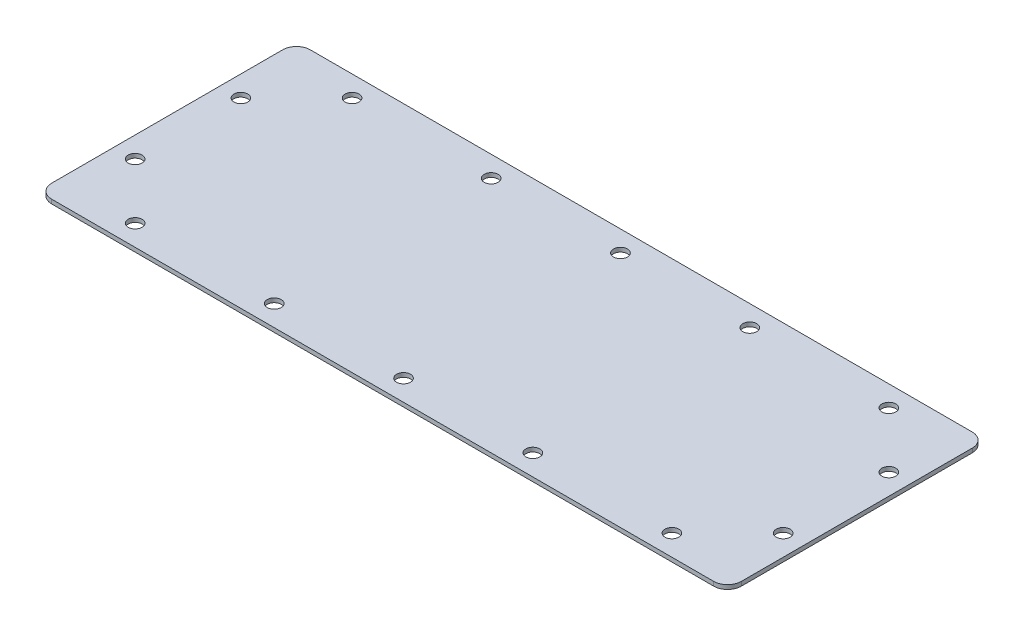
ISO-10303-21;
HEADER;
FILE_DESCRIPTION(('STEP AP214'),'2;1');
FILE_NAME('part.step','',(''),(''),'','','');
FILE_SCHEMA(('AUTOMOTIVE_DESIGN { 1 0 10303 214 1 1 1 1 }'));
ENDSEC;
DATA;
#1=APPLICATION_CONTEXT('core data for automotive mechanical design processes');
#2=APPLICATION_PROTOCOL_DEFINITION('international standard','automotive_design',2000,#1);
#3=PRODUCT_CONTEXT('',#1,'mechanical');
#4=PRODUCT('Part','Part','',(#3));
#5=PRODUCT_RELATED_PRODUCT_CATEGORY('part','',(#4));
#6=PRODUCT_DEFINITION_FORMATION('','',#4);
#7=PRODUCT_DEFINITION_CONTEXT('part definition',#1,'design');
#8=PRODUCT_DEFINITION('design','',#6,#7);
#9=PRODUCT_DEFINITION_SHAPE('','',#8);
#10=(LENGTH_UNIT() NAMED_UNIT(*) SI_UNIT(.MILLI.,.METRE.));
#11=(NAMED_UNIT(*) PLANE_ANGLE_UNIT() SI_UNIT($,.RADIAN.));
#12=(NAMED_UNIT(*) SI_UNIT($,.STERADIAN.) SOLID_ANGLE_UNIT());
#13=UNCERTAINTY_MEASURE_WITH_UNIT(LENGTH_MEASURE(1.E-05),#10,'distance_accuracy_value','');
#14=(GEOMETRIC_REPRESENTATION_CONTEXT(3) GLOBAL_UNCERTAINTY_ASSIGNED_CONTEXT((#13)) GLOBAL_UNIT_ASSIGNED_CONTEXT((#10,
#11,#12)) REPRESENTATION_CONTEXT('',''));
#15=CARTESIAN_POINT('',(0.,0.,0.));
#16=DIRECTION('',(0.,0.,1.));
#17=DIRECTION('',(1.,0.,0.));
#18=AXIS2_PLACEMENT_3D('',#15,#16,#17);
#19=CARTESIAN_POINT('',(238.,3.,-83.));
#20=DIRECTION('',(0.,-1.,0.));
#21=DIRECTION('',(0.,0.,-1.));
#22=AXIS2_PLACEMENT_3D('',#19,#20,#21);
#23=PLANE('',#22);
#24=CARTESIAN_POINT('',(238.,3.,-83.));
#25=DIRECTION('',(0.,1.,0.));
#26=DIRECTION('',(0.,0.,-1.));
#27=AXIS2_PLACEMENT_3D('',#24,#25,#26);
#28=CIRCLE('',#27,10.);
#29=CARTESIAN_POINT('',(248.,3.,-83.));
#30=VERTEX_POINT('',#29);
#31=CARTESIAN_POINT('',(238.,3.,-93.));
#32=VERTEX_POINT('',#31);
#33=EDGE_CURVE('E153',#30,#32,#28,.T.);
#34=ORIENTED_EDGE('',*,*,#33,.T.);
#35=DIRECTION('',(-1.,0.,0.));
#36=VECTOR('',#35,1.);
#37=CARTESIAN_POINT('',(-238.,3.,-93.));
#38=LINE('',#37,#36);
#39=CARTESIAN_POINT('',(-238.,3.,-93.));
#40=VERTEX_POINT('',#39);
#41=EDGE_CURVE('E101',#32,#40,#38,.T.);
#42=ORIENTED_EDGE('',*,*,#41,.T.);
#43=CARTESIAN_POINT('',(-238.,3.,-83.));
#44=DIRECTION('',(0.,1.,0.));
#45=DIRECTION('',(0.,0.,1.));
#46=AXIS2_PLACEMENT_3D('',#43,#44,#45);
#47=CIRCLE('',#46,10.);
#48=CARTESIAN_POINT('',(-248.,3.,-83.));
#49=VERTEX_POINT('',#48);
#50=EDGE_CURVE('E168',#40,#49,#47,.T.);
#51=ORIENTED_EDGE('',*,*,#50,.T.);
#52=DIRECTION('',(0.,0.,1.));
#53=VECTOR('',#52,1.);
#54=CARTESIAN_POINT('',(-248.,3.,-83.));
#55=LINE('',#54,#53);
#56=CARTESIAN_POINT('',(-248.,3.,82.9999999999999));
#57=VERTEX_POINT('',#56);
#58=EDGE_CURVE('E181',#49,#57,#55,.T.);
#59=ORIENTED_EDGE('',*,*,#58,.T.);
#60=CARTESIAN_POINT('',(-238.,3.,83.));
#61=DIRECTION('',(0.,1.,0.));
#62=DIRECTION('',(0.,0.,1.));
#63=AXIS2_PLACEMENT_3D('',#60,#61,#62);
#64=CIRCLE('',#63,10.);
#65=CARTESIAN_POINT('',(-238.,3.,93.));
#66=VERTEX_POINT('',#65);
#67=EDGE_CURVE('E120',#57,#66,#64,.T.);
#68=ORIENTED_EDGE('',*,*,#67,.T.);
#69=DIRECTION('',(1.,0.,0.));
#70=VECTOR('',#69,1.);
#71=CARTESIAN_POINT('',(-238.,3.,93.));
#72=LINE('',#71,#70);
#73=CARTESIAN_POINT('',(238.,3.,93.));
#74=VERTEX_POINT('',#73);
#75=EDGE_CURVE('E114',#66,#74,#72,.T.);
#76=ORIENTED_EDGE('',*,*,#75,.T.);
#77=CARTESIAN_POINT('',(238.,3.,83.));
#78=DIRECTION('',(0.,1.,0.));
#79=DIRECTION('',(0.,0.,1.));
#80=AXIS2_PLACEMENT_3D('',#77,#78,#79);
#81=CIRCLE('',#80,10.);
#82=CARTESIAN_POINT('',(248.,3.,82.9999999999999));
#83=VERTEX_POINT('',#82);
#84=EDGE_CURVE('E118',#74,#83,#81,.T.);
#85=ORIENTED_EDGE('',*,*,#84,.T.);
#86=DIRECTION('',(0.,0.,-1.));
#87=VECTOR('',#86,1.);
#88=CARTESIAN_POINT('',(248.,3.,-83.));
#89=LINE('',#88,#87);
#90=EDGE_CURVE('E58',#83,#30,#89,.T.);
#91=ORIENTED_EDGE('',*,*,#90,.T.);
#92=EDGE_LOOP('',(#34,#42,#51,#59,#68,#76,#85,#91));
#93=FACE_BOUND('',#92,.T.);
#94=CARTESIAN_POINT('',(-193.,3.,-78.));
#95=DIRECTION('',(0.,1.,0.));
#96=DIRECTION('',(0.,0.,1.));
#97=AXIS2_PLACEMENT_3D('',#94,#95,#96);
#98=CIRCLE('',#97,5.00000000000002);
#99=CARTESIAN_POINT('',(-193.,3.,-73.));
#100=VERTEX_POINT('',#99);
#101=EDGE_CURVE('E142',#100,#100,#98,.T.);
#102=ORIENTED_EDGE('',*,*,#101,.F.);
#103=EDGE_LOOP('',(#102));
#104=FACE_BOUND('',#103,.T.);
#105=CARTESIAN_POINT('',(-93.,3.,-78.));
#106=DIRECTION('',(0.,1.,0.));
#107=DIRECTION('',(0.,0.,1.));
#108=AXIS2_PLACEMENT_3D('',#105,#106,#107);
#109=CIRCLE('',#108,5.00000000000001);
#110=CARTESIAN_POINT('',(-93.,3.,-73.));
#111=VERTEX_POINT('',#110);
#112=EDGE_CURVE('E190',#111,#111,#109,.T.);
#113=ORIENTED_EDGE('',*,*,#112,.F.);
#114=EDGE_LOOP('',(#113));
#115=FACE_BOUND('',#114,.T.);
#116=CARTESIAN_POINT('',(0.,3.,-78.));
#117=DIRECTION('',(0.,1.,0.));
#118=DIRECTION('',(0.,0.,1.));
#119=AXIS2_PLACEMENT_3D('',#116,#117,#118);
#120=CIRCLE('',#119,5.);
#121=CARTESIAN_POINT('',(0.,3.,-73.));
#122=VERTEX_POINT('',#121);
#123=EDGE_CURVE('E196',#122,#122,#120,.T.);
#124=ORIENTED_EDGE('',*,*,#123,.F.);
#125=EDGE_LOOP('',(#124));
#126=FACE_BOUND('',#125,.T.);
#127=CARTESIAN_POINT('',(-233.,3.,-38.));
#128=DIRECTION('',(0.,1.,0.));
#129=DIRECTION('',(0.,0.,1.));
#130=AXIS2_PLACEMENT_3D('',#127,#128,#129);
#131=CIRCLE('',#130,4.99999999999999);
#132=CARTESIAN_POINT('',(-233.,3.,-33.));
#133=VERTEX_POINT('',#132);
#134=EDGE_CURVE('E202',#133,#133,#131,.T.);
#135=ORIENTED_EDGE('',*,*,#134,.F.);
#136=EDGE_LOOP('',(#135));
#137=FACE_BOUND('',#136,.T.);
#138=CARTESIAN_POINT('',(92.9999999999999,3.,-78.));
#139=DIRECTION('',(0.,1.,0.));
#140=DIRECTION('',(0.,0.,1.));
#141=AXIS2_PLACEMENT_3D('',#138,#139,#140);
#142=CIRCLE('',#141,5.00000000000001);
#143=CARTESIAN_POINT('',(92.9999999999999,3.,-73.));
#144=VERTEX_POINT('',#143);
#145=EDGE_CURVE('E208',#144,#144,#142,.T.);
#146=ORIENTED_EDGE('',*,*,#145,.F.);
#147=EDGE_LOOP('',(#146));
#148=FACE_BOUND('',#147,.T.);
#149=CARTESIAN_POINT('',(193.,3.,-78.));
#150=DIRECTION('',(0.,1.,0.));
#151=DIRECTION('',(0.,0.,1.));
#152=AXIS2_PLACEMENT_3D('',#149,#150,#151);
#153=CIRCLE('',#152,4.99999999999999);
#154=CARTESIAN_POINT('',(193.,3.,-73.));
#155=VERTEX_POINT('',#154);
#156=EDGE_CURVE('E214',#155,#155,#153,.T.);
#157=ORIENTED_EDGE('',*,*,#156,.F.);
#158=EDGE_LOOP('',(#157));
#159=FACE_BOUND('',#158,.T.);
#160=CARTESIAN_POINT('',(233.,3.,-38.));
#161=DIRECTION('',(0.,1.,0.));
#162=DIRECTION('',(0.,0.,1.));
#163=AXIS2_PLACEMENT_3D('',#160,#161,#162);
#164=CIRCLE('',#163,5.00000000000002);
#165=CARTESIAN_POINT('',(233.,3.,-33.));
#166=VERTEX_POINT('',#165);
#167=EDGE_CURVE('E220',#166,#166,#164,.T.);
#168=ORIENTED_EDGE('',*,*,#167,.F.);
#169=EDGE_LOOP('',(#168));
#170=FACE_BOUND('',#169,.T.);
#171=CARTESIAN_POINT('',(233.,3.,37.9999999999999));
#172=DIRECTION('',(0.,1.,0.));
#173=DIRECTION('',(0.,0.,-1.));
#174=AXIS2_PLACEMENT_3D('',#171,#172,#173);
#175=CIRCLE('',#174,5.00000000000002);
#176=CARTESIAN_POINT('',(233.,3.,32.9999999999999));
#177=VERTEX_POINT('',#176);
#178=EDGE_CURVE('E226',#177,#177,#175,.T.);
#179=ORIENTED_EDGE('',*,*,#178,.F.);
#180=EDGE_LOOP('',(#179));
#181=FACE_BOUND('',#180,.T.);
#182=CARTESIAN_POINT('',(193.,3.,77.9999999999999));
#183=DIRECTION('',(0.,1.,0.));
#184=DIRECTION('',(0.,0.,-1.));
#185=AXIS2_PLACEMENT_3D('',#182,#183,#184);
#186=CIRCLE('',#185,4.99999999999999);
#187=CARTESIAN_POINT('',(193.,3.,72.9999999999999));
#188=VERTEX_POINT('',#187);
#189=EDGE_CURVE('E232',#188,#188,#186,.T.);
#190=ORIENTED_EDGE('',*,*,#189,.F.);
#191=EDGE_LOOP('',(#190));
#192=FACE_BOUND('',#191,.T.);
#193=CARTESIAN_POINT('',(92.9999999999999,3.,77.9999999999999));
#194=DIRECTION('',(0.,1.,0.));
#195=DIRECTION('',(0.,0.,-1.));
#196=AXIS2_PLACEMENT_3D('',#193,#194,#195);
#197=CIRCLE('',#196,5.00000000000001);
#198=CARTESIAN_POINT('',(92.9999999999999,3.,72.9999999999999));
#199=VERTEX_POINT('',#198);
#200=EDGE_CURVE('E238',#199,#199,#197,.T.);
#201=ORIENTED_EDGE('',*,*,#200,.F.);
#202=EDGE_LOOP('',(#201));
#203=FACE_BOUND('',#202,.T.);
#204=CARTESIAN_POINT('',(0.,3.,77.9999999999999));
#205=DIRECTION('',(0.,1.,0.));
#206=DIRECTION('',(0.,0.,-1.));
#207=AXIS2_PLACEMENT_3D('',#204,#205,#206);
#208=CIRCLE('',#207,5.);
#209=CARTESIAN_POINT('',(0.,3.,72.9999999999999));
#210=VERTEX_POINT('',#209);
#211=EDGE_CURVE('E244',#210,#210,#208,.T.);
#212=ORIENTED_EDGE('',*,*,#211,.F.);
#213=EDGE_LOOP('',(#212));
#214=FACE_BOUND('',#213,.T.);
#215=CARTESIAN_POINT('',(-93.,3.,77.9999999999999));
#216=DIRECTION('',(0.,1.,0.));
#217=DIRECTION('',(0.,0.,-1.));
#218=AXIS2_PLACEMENT_3D('',#215,#216,#217);
#219=CIRCLE('',#218,5.00000000000001);
#220=CARTESIAN_POINT('',(-93.,3.,72.9999999999999));
#221=VERTEX_POINT('',#220);
#222=EDGE_CURVE('E250',#221,#221,#219,.T.);
#223=ORIENTED_EDGE('',*,*,#222,.F.);
#224=EDGE_LOOP('',(#223));
#225=FACE_BOUND('',#224,.T.);
#226=CARTESIAN_POINT('',(-193.,3.,77.9999999999999));
#227=DIRECTION('',(0.,1.,0.));
#228=DIRECTION('',(0.,0.,-1.));
#229=AXIS2_PLACEMENT_3D('',#226,#227,#228);
#230=CIRCLE('',#229,5.00000000000002);
#231=CARTESIAN_POINT('',(-193.,3.,72.9999999999999));
#232=VERTEX_POINT('',#231);
#233=EDGE_CURVE('E256',#232,#232,#230,.T.);
#234=ORIENTED_EDGE('',*,*,#233,.F.);
#235=EDGE_LOOP('',(#234));
#236=FACE_BOUND('',#235,.T.);
#237=CARTESIAN_POINT('',(-233.,3.,37.9999999999999));
#238=DIRECTION('',(0.,1.,0.));
#239=DIRECTION('',(0.,0.,-1.));
#240=AXIS2_PLACEMENT_3D('',#237,#238,#239);
#241=CIRCLE('',#240,4.99999999999999);
#242=CARTESIAN_POINT('',(-233.,3.,32.9999999999999));
#243=VERTEX_POINT('',#242);
#244=EDGE_CURVE('E262',#243,#243,#241,.T.);
#245=ORIENTED_EDGE('',*,*,#244,.F.);
#246=EDGE_LOOP('',(#245));
#247=FACE_BOUND('',#246,.T.);
#248=ADVANCED_FACE('F41',(#93,#104,#115,#126,#137,#148,#159,#170,#181,#192,#203,#214,#225,#236,
#247),#23,.F.);
#249=CARTESIAN_POINT('',(238.,0.,-83.));
#250=DIRECTION('',(0.,-1.,0.));
#251=DIRECTION('',(0.,0.,-1.));
#252=AXIS2_PLACEMENT_3D('',#249,#250,#251);
#253=PLANE('',#252);
#254=CARTESIAN_POINT('',(-193.,0.,77.9999999999999));
#255=DIRECTION('',(0.,1.,0.));
#256=DIRECTION('',(0.,0.,-1.));
#257=AXIS2_PLACEMENT_3D('',#254,#255,#256);
#258=CIRCLE('',#257,5.00000000000002);
#259=CARTESIAN_POINT('',(-193.,0.,72.9999999999999));
#260=VERTEX_POINT('',#259);
#261=EDGE_CURVE('E259',#260,#260,#258,.T.);
#262=ORIENTED_EDGE('',*,*,#261,.T.);
#263=EDGE_LOOP('',(#262));
#264=FACE_BOUND('',#263,.T.);
#265=CARTESIAN_POINT('',(0.,0.,77.9999999999999));
#266=DIRECTION('',(0.,1.,0.));
#267=DIRECTION('',(0.,0.,-1.));
#268=AXIS2_PLACEMENT_3D('',#265,#266,#267);
#269=CIRCLE('',#268,5.);
#270=CARTESIAN_POINT('',(0.,0.,72.9999999999999));
#271=VERTEX_POINT('',#270);
#272=EDGE_CURVE('E247',#271,#271,#269,.T.);
#273=ORIENTED_EDGE('',*,*,#272,.T.);
#274=EDGE_LOOP('',(#273));
#275=FACE_BOUND('',#274,.T.);
#276=CARTESIAN_POINT('',(193.,0.,77.9999999999999));
#277=DIRECTION('',(0.,1.,0.));
#278=DIRECTION('',(0.,0.,-1.));
#279=AXIS2_PLACEMENT_3D('',#276,#277,#278);
#280=CIRCLE('',#279,4.99999999999999);
#281=CARTESIAN_POINT('',(193.,0.,72.9999999999999));
#282=VERTEX_POINT('',#281);
#283=EDGE_CURVE('E235',#282,#282,#280,.T.);
#284=ORIENTED_EDGE('',*,*,#283,.T.);
#285=EDGE_LOOP('',(#284));
#286=FACE_BOUND('',#285,.T.);
#287=CARTESIAN_POINT('',(233.,0.,-38.));
#288=DIRECTION('',(0.,1.,0.));
#289=DIRECTION('',(0.,0.,1.));
#290=AXIS2_PLACEMENT_3D('',#287,#288,#289);
#291=CIRCLE('',#290,5.00000000000002);
#292=CARTESIAN_POINT('',(233.,0.,-33.));
#293=VERTEX_POINT('',#292);
#294=EDGE_CURVE('E223',#293,#293,#291,.T.);
#295=ORIENTED_EDGE('',*,*,#294,.T.);
#296=EDGE_LOOP('',(#295));
#297=FACE_BOUND('',#296,.T.);
#298=CARTESIAN_POINT('',(92.9999999999999,0.,-78.));
#299=DIRECTION('',(0.,1.,0.));
#300=DIRECTION('',(0.,0.,1.));
#301=AXIS2_PLACEMENT_3D('',#298,#299,#300);
#302=CIRCLE('',#301,5.00000000000001);
#303=CARTESIAN_POINT('',(92.9999999999999,0.,-73.));
#304=VERTEX_POINT('',#303);
#305=EDGE_CURVE('E211',#304,#304,#302,.T.);
#306=ORIENTED_EDGE('',*,*,#305,.T.);
#307=EDGE_LOOP('',(#306));
#308=FACE_BOUND('',#307,.T.);
#309=CARTESIAN_POINT('',(0.,0.,-78.));
#310=DIRECTION('',(0.,1.,0.));
#311=DIRECTION('',(0.,0.,1.));
#312=AXIS2_PLACEMENT_3D('',#309,#310,#311);
#313=CIRCLE('',#312,5.);
#314=CARTESIAN_POINT('',(0.,0.,-73.));
#315=VERTEX_POINT('',#314);
#316=EDGE_CURVE('E199',#315,#315,#313,.T.);
#317=ORIENTED_EDGE('',*,*,#316,.T.);
#318=EDGE_LOOP('',(#317));
#319=FACE_BOUND('',#318,.T.);
#320=CARTESIAN_POINT('',(-193.,0.,-78.));
#321=DIRECTION('',(0.,1.,0.));
#322=DIRECTION('',(0.,0.,1.));
#323=AXIS2_PLACEMENT_3D('',#320,#321,#322);
#324=CIRCLE('',#323,5.00000000000002);
#325=CARTESIAN_POINT('',(-193.,0.,-73.));
#326=VERTEX_POINT('',#325);
#327=EDGE_CURVE('E187',#326,#326,#324,.T.);
#328=ORIENTED_EDGE('',*,*,#327,.T.);
#329=EDGE_LOOP('',(#328));
#330=FACE_BOUND('',#329,.T.);
#331=CARTESIAN_POINT('',(238.,0.,-83.));
#332=DIRECTION('',(0.,1.,0.));
#333=DIRECTION('',(0.,0.,-1.));
#334=AXIS2_PLACEMENT_3D('',#331,#332,#333);
#335=CIRCLE('',#334,10.);
#336=CARTESIAN_POINT('',(248.,0.,-83.));
#337=VERTEX_POINT('',#336);
#338=CARTESIAN_POINT('',(238.,0.,-93.));
#339=VERTEX_POINT('',#338);
#340=EDGE_CURVE('E138',#337,#339,#335,.T.);
#341=ORIENTED_EDGE('',*,*,#340,.F.);
#342=DIRECTION('',(0.,0.,-1.));
#343=VECTOR('',#342,1.);
#344=CARTESIAN_POINT('',(248.,0.,-83.));
#345=LINE('',#344,#343);
#346=CARTESIAN_POINT('',(248.,0.,82.9999999999999));
#347=VERTEX_POINT('',#346);
#348=EDGE_CURVE('E93',#347,#337,#345,.T.);
#349=ORIENTED_EDGE('',*,*,#348,.F.);
#350=CARTESIAN_POINT('',(238.,0.,83.));
#351=DIRECTION('',(0.,1.,0.));
#352=DIRECTION('',(0.,0.,1.));
#353=AXIS2_PLACEMENT_3D('',#350,#351,#352);
#354=CIRCLE('',#353,10.);
#355=CARTESIAN_POINT('',(238.,0.,93.));
#356=VERTEX_POINT('',#355);
#357=EDGE_CURVE('E87',#356,#347,#354,.T.);
#358=ORIENTED_EDGE('',*,*,#357,.F.);
#359=DIRECTION('',(1.,0.,0.));
#360=VECTOR('',#359,1.);
#361=CARTESIAN_POINT('',(-238.,0.,93.));
#362=LINE('',#361,#360);
#363=CARTESIAN_POINT('',(-238.,0.,93.));
#364=VERTEX_POINT('',#363);
#365=EDGE_CURVE('E128',#364,#356,#362,.T.);
#366=ORIENTED_EDGE('',*,*,#365,.F.);
#367=CARTESIAN_POINT('',(-238.,0.,83.));
#368=DIRECTION('',(0.,1.,0.));
#369=DIRECTION('',(0.,0.,1.));
#370=AXIS2_PLACEMENT_3D('',#367,#368,#369);
#371=CIRCLE('',#370,10.);
#372=CARTESIAN_POINT('',(-248.,0.,82.9999999999999));
#373=VERTEX_POINT('',#372);
#374=EDGE_CURVE('E148',#373,#364,#371,.T.);
#375=ORIENTED_EDGE('',*,*,#374,.F.);
#376=DIRECTION('',(0.,0.,1.));
#377=VECTOR('',#376,1.);
#378=CARTESIAN_POINT('',(-248.,0.,-83.));
#379=LINE('',#378,#377);
#380=CARTESIAN_POINT('',(-248.,0.,-83.));
#381=VERTEX_POINT('',#380);
#382=EDGE_CURVE('E146',#381,#373,#379,.T.);
#383=ORIENTED_EDGE('',*,*,#382,.F.);
#384=CARTESIAN_POINT('',(-238.,0.,-83.));
#385=DIRECTION('',(0.,1.,0.));
#386=DIRECTION('',(0.,0.,1.));
#387=AXIS2_PLACEMENT_3D('',#384,#385,#386);
#388=CIRCLE('',#387,10.);
#389=CARTESIAN_POINT('',(-238.,0.,-93.));
#390=VERTEX_POINT('',#389);
#391=EDGE_CURVE('E144',#390,#381,#388,.T.);
#392=ORIENTED_EDGE('',*,*,#391,.F.);
#393=DIRECTION('',(-1.,0.,0.));
#394=VECTOR('',#393,1.);
#395=CARTESIAN_POINT('',(-238.,0.,-93.));
#396=LINE('',#395,#394);
#397=EDGE_CURVE('E141',#339,#390,#396,.T.);
#398=ORIENTED_EDGE('',*,*,#397,.F.);
#399=EDGE_LOOP('',(#341,#349,#358,#366,#375,#383,#392,#398));
#400=FACE_BOUND('',#399,.T.);
#401=CARTESIAN_POINT('',(-93.,0.,-78.));
#402=DIRECTION('',(0.,1.,0.));
#403=DIRECTION('',(0.,0.,1.));
#404=AXIS2_PLACEMENT_3D('',#401,#402,#403);
#405=CIRCLE('',#404,5.00000000000001);
#406=CARTESIAN_POINT('',(-93.,0.,-73.));
#407=VERTEX_POINT('',#406);
#408=EDGE_CURVE('E193',#407,#407,#405,.T.);
#409=ORIENTED_EDGE('',*,*,#408,.T.);
#410=EDGE_LOOP('',(#409));
#411=FACE_BOUND('',#410,.T.);
#412=CARTESIAN_POINT('',(-233.,0.,-38.));
#413=DIRECTION('',(0.,1.,0.));
#414=DIRECTION('',(0.,0.,1.));
#415=AXIS2_PLACEMENT_3D('',#412,#413,#414);
#416=CIRCLE('',#415,4.99999999999999);
#417=CARTESIAN_POINT('',(-233.,0.,-33.));
#418=VERTEX_POINT('',#417);
#419=EDGE_CURVE('E205',#418,#418,#416,.T.);
#420=ORIENTED_EDGE('',*,*,#419,.T.);
#421=EDGE_LOOP('',(#420));
#422=FACE_BOUND('',#421,.T.);
#423=CARTESIAN_POINT('',(193.,0.,-78.));
#424=DIRECTION('',(0.,1.,0.));
#425=DIRECTION('',(0.,0.,1.));
#426=AXIS2_PLACEMENT_3D('',#423,#424,#425);
#427=CIRCLE('',#426,4.99999999999999);
#428=CARTESIAN_POINT('',(193.,0.,-73.));
#429=VERTEX_POINT('',#428);
#430=EDGE_CURVE('E217',#429,#429,#427,.T.);
#431=ORIENTED_EDGE('',*,*,#430,.T.);
#432=EDGE_LOOP('',(#431));
#433=FACE_BOUND('',#432,.T.);
#434=CARTESIAN_POINT('',(233.,0.,37.9999999999999));
#435=DIRECTION('',(0.,1.,0.));
#436=DIRECTION('',(0.,0.,-1.));
#437=AXIS2_PLACEMENT_3D('',#434,#435,#436);
#438=CIRCLE('',#437,5.00000000000002);
#439=CARTESIAN_POINT('',(233.,0.,32.9999999999999));
#440=VERTEX_POINT('',#439);
#441=EDGE_CURVE('E229',#440,#440,#438,.T.);
#442=ORIENTED_EDGE('',*,*,#441,.T.);
#443=EDGE_LOOP('',(#442));
#444=FACE_BOUND('',#443,.T.);
#445=CARTESIAN_POINT('',(92.9999999999999,0.,77.9999999999999));
#446=DIRECTION('',(0.,1.,0.));
#447=DIRECTION('',(0.,0.,-1.));
#448=AXIS2_PLACEMENT_3D('',#445,#446,#447);
#449=CIRCLE('',#448,5.00000000000001);
#450=CARTESIAN_POINT('',(92.9999999999999,0.,72.9999999999999));
#451=VERTEX_POINT('',#450);
#452=EDGE_CURVE('E241',#451,#451,#449,.T.);
#453=ORIENTED_EDGE('',*,*,#452,.T.);
#454=EDGE_LOOP('',(#453));
#455=FACE_BOUND('',#454,.T.);
#456=CARTESIAN_POINT('',(-93.,0.,77.9999999999999));
#457=DIRECTION('',(0.,1.,0.));
#458=DIRECTION('',(0.,0.,-1.));
#459=AXIS2_PLACEMENT_3D('',#456,#457,#458);
#460=CIRCLE('',#459,5.00000000000001);
#461=CARTESIAN_POINT('',(-93.,0.,72.9999999999999));
#462=VERTEX_POINT('',#461);
#463=EDGE_CURVE('E253',#462,#462,#460,.T.);
#464=ORIENTED_EDGE('',*,*,#463,.T.);
#465=EDGE_LOOP('',(#464));
#466=FACE_BOUND('',#465,.T.);
#467=CARTESIAN_POINT('',(-233.,0.,37.9999999999999));
#468=DIRECTION('',(0.,1.,0.));
#469=DIRECTION('',(0.,0.,-1.));
#470=AXIS2_PLACEMENT_3D('',#467,#468,#469);
#471=CIRCLE('',#470,4.99999999999999);
#472=CARTESIAN_POINT('',(-233.,0.,32.9999999999999));
#473=VERTEX_POINT('',#472);
#474=EDGE_CURVE('E265',#473,#473,#471,.T.);
#475=ORIENTED_EDGE('',*,*,#474,.T.);
#476=EDGE_LOOP('',(#475));
#477=FACE_BOUND('',#476,.T.);
#478=ADVANCED_FACE('F172',(#264,#275,#286,#297,#308,#319,#330,#400,#411,#422,#433,#444,#455,
#466,#477),#253,.T.);
#479=CARTESIAN_POINT('',(238.,3.,-83.));
#480=DIRECTION('',(0.,-1.,0.));
#481=DIRECTION('',(0.,0.,-1.));
#482=AXIS2_PLACEMENT_3D('',#479,#480,#481);
#483=CYLINDRICAL_SURFACE('',#482,10.);
#484=ORIENTED_EDGE('',*,*,#340,.T.);
#485=DIRECTION('',(0.,-1.,0.));
#486=VECTOR('',#485,1.);
#487=CARTESIAN_POINT('',(238.,3.,-93.));
#488=LINE('',#487,#486);
#489=EDGE_CURVE('E11',#32,#339,#488,.T.);
#490=ORIENTED_EDGE('',*,*,#489,.F.);
#491=ORIENTED_EDGE('',*,*,#33,.F.);
#492=DIRECTION('',(0.,-1.,0.));
#493=VECTOR('',#492,1.);
#494=CARTESIAN_POINT('',(248.,3.,-83.));
#495=LINE('',#494,#493);
#496=EDGE_CURVE('E134',#30,#337,#495,.T.);
#497=ORIENTED_EDGE('',*,*,#496,.T.);
#498=EDGE_LOOP('',(#484,#490,#491,#497));
#499=FACE_BOUND('',#498,.T.);
#500=ADVANCED_FACE('F43',(#499),#483,.T.);
#501=CARTESIAN_POINT('',(-238.,3.,-93.));
#502=DIRECTION('',(0.,0.,1.));
#503=DIRECTION('',(1.,0.,0.));
#504=AXIS2_PLACEMENT_3D('',#501,#502,#503);
#505=PLANE('',#504);
#506=ORIENTED_EDGE('',*,*,#397,.T.);
#507=DIRECTION('',(0.,-1.,0.));
#508=VECTOR('',#507,1.);
#509=CARTESIAN_POINT('',(-238.,3.,-93.));
#510=LINE('',#509,#508);
#511=EDGE_CURVE('E50',#40,#390,#510,.T.);
#512=ORIENTED_EDGE('',*,*,#511,.F.);
#513=ORIENTED_EDGE('',*,*,#41,.F.);
#514=ORIENTED_EDGE('',*,*,#489,.T.);
#515=EDGE_LOOP('',(#506,#512,#513,#514));
#516=FACE_BOUND('',#515,.T.);
#517=ADVANCED_FACE('F297',(#516),#505,.F.);
#518=CARTESIAN_POINT('',(-238.,3.,-83.));
#519=DIRECTION('',(0.,-1.,0.));
#520=DIRECTION('',(0.,0.,-1.));
#521=AXIS2_PLACEMENT_3D('',#518,#519,#520);
#522=CYLINDRICAL_SURFACE('',#521,10.);
#523=ORIENTED_EDGE('',*,*,#391,.T.);
#524=DIRECTION('',(0.,-1.,0.));
#525=VECTOR('',#524,1.);
#526=CARTESIAN_POINT('',(-248.,3.,-83.));
#527=LINE('',#526,#525);
#528=EDGE_CURVE('E160',#49,#381,#527,.T.);
#529=ORIENTED_EDGE('',*,*,#528,.F.);
#530=ORIENTED_EDGE('',*,*,#50,.F.);
#531=ORIENTED_EDGE('',*,*,#511,.T.);
#532=EDGE_LOOP('',(#523,#529,#530,#531));
#533=FACE_BOUND('',#532,.T.);
#534=ADVANCED_FACE('F166',(#533),#522,.T.);
#535=CARTESIAN_POINT('',(-248.,3.,-83.));
#536=DIRECTION('',(1.,0.,0.));
#537=DIRECTION('',(0.,0.,-1.));
#538=AXIS2_PLACEMENT_3D('',#535,#536,#537);
#539=PLANE('',#538);
#540=ORIENTED_EDGE('',*,*,#382,.T.);
#541=DIRECTION('',(0.,-1.,0.));
#542=VECTOR('',#541,1.);
#543=CARTESIAN_POINT('',(-248.,3.,82.9999999999999));
#544=LINE('',#543,#542);
#545=EDGE_CURVE('E157',#57,#373,#544,.T.);
#546=ORIENTED_EDGE('',*,*,#545,.F.);
#547=ORIENTED_EDGE('',*,*,#58,.F.);
#548=ORIENTED_EDGE('',*,*,#528,.T.);
#549=EDGE_LOOP('',(#540,#546,#547,#548));
#550=FACE_BOUND('',#549,.T.);
#551=ADVANCED_FACE('F177',(#550),#539,.F.);
#552=CARTESIAN_POINT('',(-238.,3.,83.));
#553=DIRECTION('',(0.,-1.,0.));
#554=DIRECTION('',(0.,0.,-1.));
#555=AXIS2_PLACEMENT_3D('',#552,#553,#554);
#556=CYLINDRICAL_SURFACE('',#555,10.);
#557=ORIENTED_EDGE('',*,*,#374,.T.);
#558=DIRECTION('',(0.,-1.,0.));
#559=VECTOR('',#558,1.);
#560=CARTESIAN_POINT('',(-238.,3.,93.));
#561=LINE('',#560,#559);
#562=EDGE_CURVE('E129',#66,#364,#561,.T.);
#563=ORIENTED_EDGE('',*,*,#562,.F.);
#564=ORIENTED_EDGE('',*,*,#67,.F.);
#565=ORIENTED_EDGE('',*,*,#545,.T.);
#566=EDGE_LOOP('',(#557,#563,#564,#565));
#567=FACE_BOUND('',#566,.T.);
#568=ADVANCED_FACE('F180',(#567),#556,.T.);
#569=CARTESIAN_POINT('',(-238.,3.,93.));
#570=DIRECTION('',(0.,0.,-1.));
#571=DIRECTION('',(-1.,0.,0.));
#572=AXIS2_PLACEMENT_3D('',#569,#570,#571);
#573=PLANE('',#572);
#574=ORIENTED_EDGE('',*,*,#365,.T.);
#575=DIRECTION('',(0.,-1.,0.));
#576=VECTOR('',#575,1.);
#577=CARTESIAN_POINT('',(238.,3.,93.));
#578=LINE('',#577,#576);
#579=EDGE_CURVE('E125',#74,#356,#578,.T.);
#580=ORIENTED_EDGE('',*,*,#579,.F.);
#581=ORIENTED_EDGE('',*,*,#75,.F.);
#582=ORIENTED_EDGE('',*,*,#562,.T.);
#583=EDGE_LOOP('',(#574,#580,#581,#582));
#584=FACE_BOUND('',#583,.T.);
#585=ADVANCED_FACE('F126',(#584),#573,.F.);
#586=CARTESIAN_POINT('',(238.,3.,83.));
#587=DIRECTION('',(0.,-1.,0.));
#588=DIRECTION('',(0.,0.,-1.));
#589=AXIS2_PLACEMENT_3D('',#586,#587,#588);
#590=CYLINDRICAL_SURFACE('',#589,10.);
#591=ORIENTED_EDGE('',*,*,#357,.T.);
#592=DIRECTION('',(0.,-1.,0.));
#593=VECTOR('',#592,1.);
#594=CARTESIAN_POINT('',(248.,3.,82.9999999999999));
#595=LINE('',#594,#593);
#596=EDGE_CURVE('E130',#83,#347,#595,.T.);
#597=ORIENTED_EDGE('',*,*,#596,.F.);
#598=ORIENTED_EDGE('',*,*,#84,.F.);
#599=ORIENTED_EDGE('',*,*,#579,.T.);
#600=EDGE_LOOP('',(#591,#597,#598,#599));
#601=FACE_BOUND('',#600,.T.);
#602=ADVANCED_FACE('F132',(#601),#590,.T.);
#603=CARTESIAN_POINT('',(248.,3.,-83.));
#604=DIRECTION('',(-1.,0.,0.));
#605=DIRECTION('',(0.,0.,1.));
#606=AXIS2_PLACEMENT_3D('',#603,#604,#605);
#607=PLANE('',#606);
#608=ORIENTED_EDGE('',*,*,#348,.T.);
#609=ORIENTED_EDGE('',*,*,#496,.F.);
#610=ORIENTED_EDGE('',*,*,#90,.F.);
#611=ORIENTED_EDGE('',*,*,#596,.T.);
#612=EDGE_LOOP('',(#608,#609,#610,#611));
#613=FACE_BOUND('',#612,.T.);
#614=ADVANCED_FACE('F285',(#613),#607,.F.);
#615=CARTESIAN_POINT('',(-193.,3.,-78.));
#616=DIRECTION('',(0.,-1.,0.));
#617=DIRECTION('',(0.,0.,-1.));
#618=AXIS2_PLACEMENT_3D('',#615,#616,#617);
#619=CYLINDRICAL_SURFACE('',#618,5.00000000000002);
#620=ORIENTED_EDGE('',*,*,#101,.T.);
#621=EDGE_LOOP('',(#620));
#622=FACE_BOUND('',#621,.T.);
#623=ORIENTED_EDGE('',*,*,#327,.F.);
#624=EDGE_LOOP('',(#623));
#625=FACE_BOUND('',#624,.T.);
#626=ADVANCED_FACE('F282',(#622,#625),#619,.F.);
#627=CARTESIAN_POINT('',(-93.,3.,-78.));
#628=DIRECTION('',(0.,-1.,0.));
#629=DIRECTION('',(0.,0.,-1.));
#630=AXIS2_PLACEMENT_3D('',#627,#628,#629);
#631=CYLINDRICAL_SURFACE('',#630,5.00000000000001);
#632=ORIENTED_EDGE('',*,*,#112,.T.);
#633=EDGE_LOOP('',(#632));
#634=FACE_BOUND('',#633,.T.);
#635=ORIENTED_EDGE('',*,*,#408,.F.);
#636=EDGE_LOOP('',(#635));
#637=FACE_BOUND('',#636,.T.);
#638=ADVANCED_FACE('F360',(#634,#637),#631,.F.);
#639=CARTESIAN_POINT('',(0.,3.,-78.));
#640=DIRECTION('',(0.,-1.,0.));
#641=DIRECTION('',(0.,0.,-1.));
#642=AXIS2_PLACEMENT_3D('',#639,#640,#641);
#643=CYLINDRICAL_SURFACE('',#642,5.);
#644=ORIENTED_EDGE('',*,*,#123,.T.);
#645=EDGE_LOOP('',(#644));
#646=FACE_BOUND('',#645,.T.);
#647=ORIENTED_EDGE('',*,*,#316,.F.);
#648=EDGE_LOOP('',(#647));
#649=FACE_BOUND('',#648,.T.);
#650=ADVANCED_FACE('F368',(#646,#649),#643,.F.);
#651=CARTESIAN_POINT('',(-233.,3.,-38.));
#652=DIRECTION('',(0.,-1.,0.));
#653=DIRECTION('',(0.,0.,-1.));
#654=AXIS2_PLACEMENT_3D('',#651,#652,#653);
#655=CYLINDRICAL_SURFACE('',#654,4.99999999999999);
#656=ORIENTED_EDGE('',*,*,#134,.T.);
#657=EDGE_LOOP('',(#656));
#658=FACE_BOUND('',#657,.T.);
#659=ORIENTED_EDGE('',*,*,#419,.F.);
#660=EDGE_LOOP('',(#659));
#661=FACE_BOUND('',#660,.T.);
#662=ADVANCED_FACE('F376',(#658,#661),#655,.F.);
#663=CARTESIAN_POINT('',(92.9999999999999,3.,-78.));
#664=DIRECTION('',(0.,-1.,0.));
#665=DIRECTION('',(0.,0.,-1.));
#666=AXIS2_PLACEMENT_3D('',#663,#664,#665);
#667=CYLINDRICAL_SURFACE('',#666,5.00000000000001);
#668=ORIENTED_EDGE('',*,*,#145,.T.);
#669=EDGE_LOOP('',(#668));
#670=FACE_BOUND('',#669,.T.);
#671=ORIENTED_EDGE('',*,*,#305,.F.);
#672=EDGE_LOOP('',(#671));
#673=FACE_BOUND('',#672,.T.);
#674=ADVANCED_FACE('F385',(#670,#673),#667,.F.);
#675=CARTESIAN_POINT('',(193.,3.,-78.));
#676=DIRECTION('',(0.,-1.,0.));
#677=DIRECTION('',(0.,0.,-1.));
#678=AXIS2_PLACEMENT_3D('',#675,#676,#677);
#679=CYLINDRICAL_SURFACE('',#678,4.99999999999999);
#680=ORIENTED_EDGE('',*,*,#156,.T.);
#681=EDGE_LOOP('',(#680));
#682=FACE_BOUND('',#681,.T.);
#683=ORIENTED_EDGE('',*,*,#430,.F.);
#684=EDGE_LOOP('',(#683));
#685=FACE_BOUND('',#684,.T.);
#686=ADVANCED_FACE('F394',(#682,#685),#679,.F.);
#687=CARTESIAN_POINT('',(233.,3.,-38.));
#688=DIRECTION('',(0.,-1.,0.));
#689=DIRECTION('',(0.,0.,-1.));
#690=AXIS2_PLACEMENT_3D('',#687,#688,#689);
#691=CYLINDRICAL_SURFACE('',#690,5.00000000000002);
#692=ORIENTED_EDGE('',*,*,#167,.T.);
#693=EDGE_LOOP('',(#692));
#694=FACE_BOUND('',#693,.T.);
#695=ORIENTED_EDGE('',*,*,#294,.F.);
#696=EDGE_LOOP('',(#695));
#697=FACE_BOUND('',#696,.T.);
#698=ADVANCED_FACE('F403',(#694,#697),#691,.F.);
#699=CARTESIAN_POINT('',(233.,3.,37.9999999999999));
#700=DIRECTION('',(0.,-1.,0.));
#701=DIRECTION('',(0.,0.,-1.));
#702=AXIS2_PLACEMENT_3D('',#699,#700,#701);
#703=CYLINDRICAL_SURFACE('',#702,5.00000000000002);
#704=ORIENTED_EDGE('',*,*,#178,.T.);
#705=EDGE_LOOP('',(#704));
#706=FACE_BOUND('',#705,.T.);
#707=ORIENTED_EDGE('',*,*,#441,.F.);
#708=EDGE_LOOP('',(#707));
#709=FACE_BOUND('',#708,.T.);
#710=ADVANCED_FACE('F412',(#706,#709),#703,.F.);
#711=CARTESIAN_POINT('',(193.,3.,77.9999999999999));
#712=DIRECTION('',(0.,-1.,0.));
#713=DIRECTION('',(0.,0.,-1.));
#714=AXIS2_PLACEMENT_3D('',#711,#712,#713);
#715=CYLINDRICAL_SURFACE('',#714,4.99999999999999);
#716=ORIENTED_EDGE('',*,*,#189,.T.);
#717=EDGE_LOOP('',(#716));
#718=FACE_BOUND('',#717,.T.);
#719=ORIENTED_EDGE('',*,*,#283,.F.);
#720=EDGE_LOOP('',(#719));
#721=FACE_BOUND('',#720,.T.);
#722=ADVANCED_FACE('F421',(#718,#721),#715,.F.);
#723=CARTESIAN_POINT('',(92.9999999999999,3.,77.9999999999999));
#724=DIRECTION('',(0.,-1.,0.));
#725=DIRECTION('',(0.,0.,-1.));
#726=AXIS2_PLACEMENT_3D('',#723,#724,#725);
#727=CYLINDRICAL_SURFACE('',#726,5.00000000000001);
#728=ORIENTED_EDGE('',*,*,#200,.T.);
#729=EDGE_LOOP('',(#728));
#730=FACE_BOUND('',#729,.T.);
#731=ORIENTED_EDGE('',*,*,#452,.F.);
#732=EDGE_LOOP('',(#731));
#733=FACE_BOUND('',#732,.T.);
#734=ADVANCED_FACE('F430',(#730,#733),#727,.F.);
#735=CARTESIAN_POINT('',(0.,3.,77.9999999999999));
#736=DIRECTION('',(0.,-1.,0.));
#737=DIRECTION('',(0.,0.,-1.));
#738=AXIS2_PLACEMENT_3D('',#735,#736,#737);
#739=CYLINDRICAL_SURFACE('',#738,5.);
#740=ORIENTED_EDGE('',*,*,#211,.T.);
#741=EDGE_LOOP('',(#740));
#742=FACE_BOUND('',#741,.T.);
#743=ORIENTED_EDGE('',*,*,#272,.F.);
#744=EDGE_LOOP('',(#743));
#745=FACE_BOUND('',#744,.T.);
#746=ADVANCED_FACE('F439',(#742,#745),#739,.F.);
#747=CARTESIAN_POINT('',(-93.,3.,77.9999999999999));
#748=DIRECTION('',(0.,-1.,0.));
#749=DIRECTION('',(0.,0.,-1.));
#750=AXIS2_PLACEMENT_3D('',#747,#748,#749);
#751=CYLINDRICAL_SURFACE('',#750,5.00000000000001);
#752=ORIENTED_EDGE('',*,*,#222,.T.);
#753=EDGE_LOOP('',(#752));
#754=FACE_BOUND('',#753,.T.);
#755=ORIENTED_EDGE('',*,*,#463,.F.);
#756=EDGE_LOOP('',(#755));
#757=FACE_BOUND('',#756,.T.);
#758=ADVANCED_FACE('F448',(#754,#757),#751,.F.);
#759=CARTESIAN_POINT('',(-193.,3.,77.9999999999999));
#760=DIRECTION('',(0.,-1.,0.));
#761=DIRECTION('',(0.,0.,-1.));
#762=AXIS2_PLACEMENT_3D('',#759,#760,#761);
#763=CYLINDRICAL_SURFACE('',#762,5.00000000000002);
#764=ORIENTED_EDGE('',*,*,#233,.T.);
#765=EDGE_LOOP('',(#764));
#766=FACE_BOUND('',#765,.T.);
#767=ORIENTED_EDGE('',*,*,#261,.F.);
#768=EDGE_LOOP('',(#767));
#769=FACE_BOUND('',#768,.T.);
#770=ADVANCED_FACE('F457',(#766,#769),#763,.F.);
#771=CARTESIAN_POINT('',(-233.,3.,37.9999999999999));
#772=DIRECTION('',(0.,-1.,0.));
#773=DIRECTION('',(0.,0.,-1.));
#774=AXIS2_PLACEMENT_3D('',#771,#772,#773);
#775=CYLINDRICAL_SURFACE('',#774,4.99999999999999);
#776=ORIENTED_EDGE('',*,*,#244,.T.);
#777=EDGE_LOOP('',(#776));
#778=FACE_BOUND('',#777,.T.);
#779=ORIENTED_EDGE('',*,*,#474,.F.);
#780=EDGE_LOOP('',(#779));
#781=FACE_BOUND('',#780,.T.);
#782=ADVANCED_FACE('F271',(#778,#781),#775,.F.);
#783=CLOSED_SHELL('',(#248,#478,#500,#517,#534,#551,#568,#585,#602,#614,#626,#638,#650,#662,
#674,#686,#698,#710,#722,#734,#746,#758,#770,#782));
#784=MANIFOLD_SOLID_BREP('B2',#783);
#785=ADVANCED_BREP_SHAPE_REPRESENTATION('',(#18,#784),#14);
#786=SHAPE_DEFINITION_REPRESENTATION(#9,#785);
ENDSEC;
END-ISO-10303-21;
